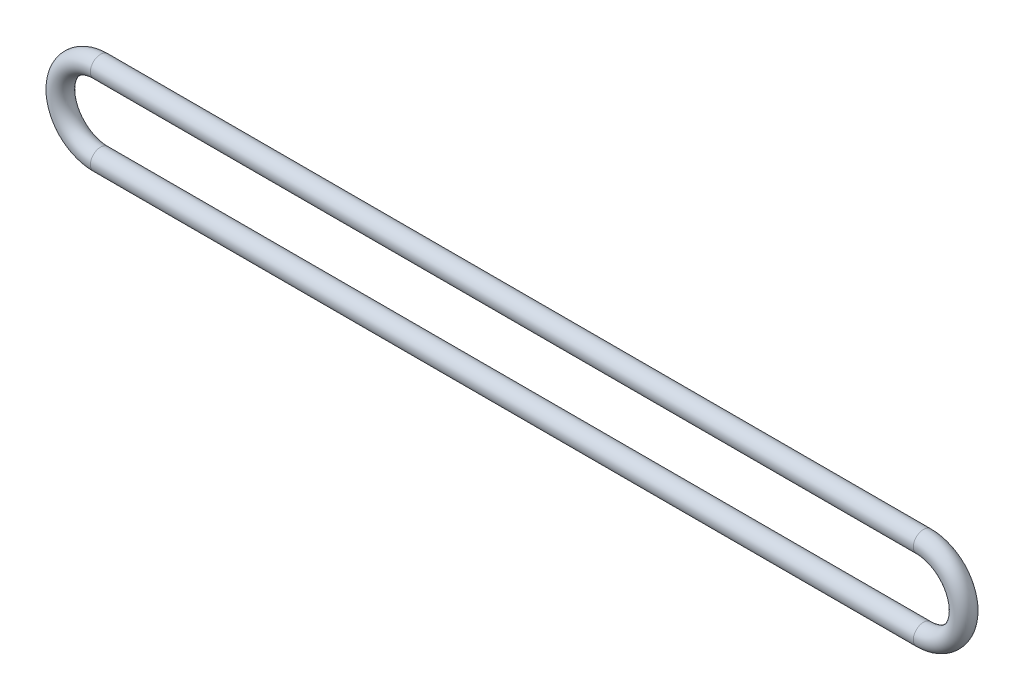
ISO-10303-21;
HEADER;
FILE_DESCRIPTION(('STEP AP214'),'2;1');
FILE_NAME('part.step','',(''),(''),'','','');
FILE_SCHEMA(('AUTOMOTIVE_DESIGN { 1 0 10303 214 1 1 1 1 }'));
ENDSEC;
DATA;
#1=APPLICATION_CONTEXT('core data for automotive mechanical design processes');
#2=APPLICATION_PROTOCOL_DEFINITION('international standard','automotive_design',2000,#1);
#3=PRODUCT_CONTEXT('',#1,'mechanical');
#4=PRODUCT('Part','Part','',(#3));
#5=PRODUCT_RELATED_PRODUCT_CATEGORY('part','',(#4));
#6=PRODUCT_DEFINITION_FORMATION('','',#4);
#7=PRODUCT_DEFINITION_CONTEXT('part definition',#1,'design');
#8=PRODUCT_DEFINITION('design','',#6,#7);
#9=PRODUCT_DEFINITION_SHAPE('','',#8);
#10=(LENGTH_UNIT() NAMED_UNIT(*) SI_UNIT(.MILLI.,.METRE.));
#11=(NAMED_UNIT(*) PLANE_ANGLE_UNIT() SI_UNIT($,.RADIAN.));
#12=(NAMED_UNIT(*) SI_UNIT($,.STERADIAN.) SOLID_ANGLE_UNIT());
#13=UNCERTAINTY_MEASURE_WITH_UNIT(LENGTH_MEASURE(1.E-05),#10,'distance_accuracy_value','');
#14=(GEOMETRIC_REPRESENTATION_CONTEXT(3) GLOBAL_UNCERTAINTY_ASSIGNED_CONTEXT((#13)) GLOBAL_UNIT_ASSIGNED_CONTEXT((#10,
#11,#12)) REPRESENTATION_CONTEXT('',''));
#15=CARTESIAN_POINT('',(0.,0.,0.));
#16=DIRECTION('',(0.,0.,1.));
#17=DIRECTION('',(1.,0.,0.));
#18=AXIS2_PLACEMENT_3D('',#15,#16,#17);
#19=CARTESIAN_POINT('',(-149.887077795981,36.381818823215,0.));
#20=DIRECTION('',(1.,0.,0.));
#21=DIRECTION('',(0.,1.,0.));
#22=AXIS2_PLACEMENT_3D('',#19,#20,#21);
#23=CYLINDRICAL_SURFACE('',#22,5.334);
#24=CARTESIAN_POINT('',(-149.887077795981,36.3818188232151,0.));
#25=DIRECTION('',(1.,0.,0.));
#26=DIRECTION('',(0.,1.,0.));
#27=AXIS2_PLACEMENT_3D('',#24,#25,#26);
#28=CIRCLE('',#27,5.334);
#29=CARTESIAN_POINT('',(-149.887077795981,41.7158188232151,0.));
#30=VERTEX_POINT('',#29);
#31=EDGE_CURVE('E49',#30,#30,#28,.F.);
#32=ORIENTED_EDGE('',*,*,#31,.F.);
#33=EDGE_LOOP('',(#32));
#34=FACE_BOUND('',#33,.T.);
#35=CARTESIAN_POINT('',(281.912922204019,36.3818188232151,0.));
#36=DIRECTION('',(1.,0.,0.));
#37=DIRECTION('',(0.,1.,0.));
#38=AXIS2_PLACEMENT_3D('',#35,#36,#37);
#39=CIRCLE('',#38,5.334);
#40=CARTESIAN_POINT('',(281.912922204019,41.7158188232151,0.));
#41=VERTEX_POINT('',#40);
#42=EDGE_CURVE('E27',#41,#41,#39,.T.);
#43=ORIENTED_EDGE('',*,*,#42,.F.);
#44=EDGE_LOOP('',(#43));
#45=FACE_BOUND('',#44,.T.);
#46=ADVANCED_FACE('F15',(#34,#45),#23,.T.);
#47=CARTESIAN_POINT('',(-149.887077795981,15.2998188232151,0.));
#48=DIRECTION('',(0.,0.,-1.));
#49=DIRECTION('',(1.,0.,0.));
#50=AXIS2_PLACEMENT_3D('',#47,#48,#49);
#51=TOROIDAL_SURFACE('',#50,21.082,5.334);
#52=CARTESIAN_POINT('',(-149.887077795981,-5.78218117678485,0.));
#53=DIRECTION('',(-1.,0.,0.));
#54=DIRECTION('',(0.,0.,1.));
#55=AXIS2_PLACEMENT_3D('',#52,#53,#54);
#56=CIRCLE('',#55,5.334);
#57=CARTESIAN_POINT('',(-149.887077795981,-5.78218117678485,5.334));
#58=VERTEX_POINT('',#57);
#59=EDGE_CURVE('E22',#58,#58,#56,.F.);
#60=ORIENTED_EDGE('',*,*,#59,.F.);
#61=EDGE_LOOP('',(#60));
#62=FACE_BOUND('',#61,.T.);
#63=ORIENTED_EDGE('',*,*,#31,.T.);
#64=EDGE_LOOP('',(#63));
#65=FACE_BOUND('',#64,.T.);
#66=ADVANCED_FACE('F42',(#62,#65),#51,.T.);
#67=CARTESIAN_POINT('',(281.912922204019,15.2998188232151,0.));
#68=DIRECTION('',(0.,0.,-1.));
#69=DIRECTION('',(-1.,0.,0.));
#70=AXIS2_PLACEMENT_3D('',#67,#68,#69);
#71=TOROIDAL_SURFACE('',#70,21.082,5.334);
#72=ORIENTED_EDGE('',*,*,#42,.T.);
#73=EDGE_LOOP('',(#72));
#74=FACE_BOUND('',#73,.T.);
#75=CARTESIAN_POINT('',(281.912922204019,-5.78218117678485,0.));
#76=DIRECTION('',(-1.,0.,0.));
#77=DIRECTION('',(0.,0.,1.));
#78=AXIS2_PLACEMENT_3D('',#75,#76,#77);
#79=CIRCLE('',#78,5.334);
#80=CARTESIAN_POINT('',(281.912922204019,-5.78218117678485,5.334));
#81=VERTEX_POINT('',#80);
#82=EDGE_CURVE('E10',#81,#81,#79,.T.);
#83=ORIENTED_EDGE('',*,*,#82,.F.);
#84=EDGE_LOOP('',(#83));
#85=FACE_BOUND('',#84,.T.);
#86=ADVANCED_FACE('F38',(#74,#85),#71,.T.);
#87=CARTESIAN_POINT('',(281.912922204019,-5.78218117678485,0.));
#88=DIRECTION('',(-1.,0.,0.));
#89=DIRECTION('',(0.,0.,1.));
#90=AXIS2_PLACEMENT_3D('',#87,#88,#89);
#91=CYLINDRICAL_SURFACE('',#90,5.334);
#92=ORIENTED_EDGE('',*,*,#82,.T.);
#93=EDGE_LOOP('',(#92));
#94=FACE_BOUND('',#93,.T.);
#95=ORIENTED_EDGE('',*,*,#59,.T.);
#96=EDGE_LOOP('',(#95));
#97=FACE_BOUND('',#96,.T.);
#98=ADVANCED_FACE('F41',(#94,#97),#91,.T.);
#99=CLOSED_SHELL('',(#46,#66,#86,#98));
#100=MANIFOLD_SOLID_BREP('B1',#99);
#101=ADVANCED_BREP_SHAPE_REPRESENTATION('',(#18,#100),#14);
#102=SHAPE_DEFINITION_REPRESENTATION(#9,#101);
ENDSEC;
END-ISO-10303-21;
